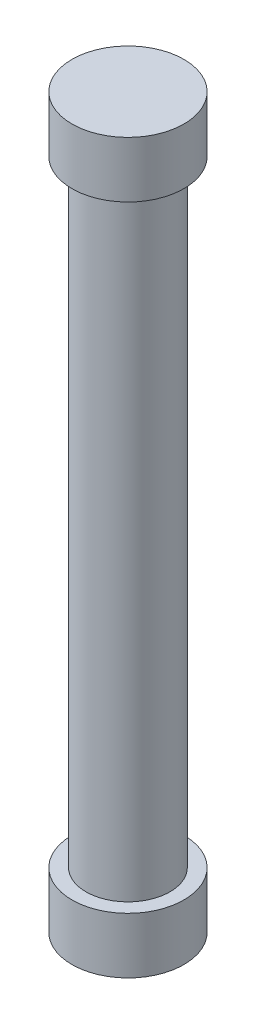
ISO-10303-21;
HEADER;
FILE_DESCRIPTION(('STEP AP214'),'2;1');
FILE_NAME('part.step','',(''),(''),'','','');
FILE_SCHEMA(('AUTOMOTIVE_DESIGN { 1 0 10303 214 1 1 1 1 }'));
ENDSEC;
DATA;
#1=APPLICATION_CONTEXT('core data for automotive mechanical design processes');
#2=APPLICATION_PROTOCOL_DEFINITION('international standard','automotive_design',2000,#1);
#3=PRODUCT_CONTEXT('',#1,'mechanical');
#4=PRODUCT('Part','Part','',(#3));
#5=PRODUCT_RELATED_PRODUCT_CATEGORY('part','',(#4));
#6=PRODUCT_DEFINITION_FORMATION('','',#4);
#7=PRODUCT_DEFINITION_CONTEXT('part definition',#1,'design');
#8=PRODUCT_DEFINITION('design','',#6,#7);
#9=PRODUCT_DEFINITION_SHAPE('','',#8);
#10=(LENGTH_UNIT() NAMED_UNIT(*) SI_UNIT(.MILLI.,.METRE.));
#11=(NAMED_UNIT(*) PLANE_ANGLE_UNIT() SI_UNIT($,.RADIAN.));
#12=(NAMED_UNIT(*) SI_UNIT($,.STERADIAN.) SOLID_ANGLE_UNIT());
#13=UNCERTAINTY_MEASURE_WITH_UNIT(LENGTH_MEASURE(1.E-05),#10,'distance_accuracy_value','');
#14=(GEOMETRIC_REPRESENTATION_CONTEXT(3) GLOBAL_UNCERTAINTY_ASSIGNED_CONTEXT((#13)) GLOBAL_UNIT_ASSIGNED_CONTEXT((#10,
#11,#12)) REPRESENTATION_CONTEXT('',''));
#15=CARTESIAN_POINT('',(0.,0.,0.));
#16=DIRECTION('',(0.,0.,1.));
#17=DIRECTION('',(1.,0.,0.));
#18=AXIS2_PLACEMENT_3D('',#15,#16,#17);
#19=CARTESIAN_POINT('',(2.,0.,0.));
#20=DIRECTION('',(0.,-1.,0.));
#21=DIRECTION('',(1.,0.,0.));
#22=AXIS2_PLACEMENT_3D('',#19,#20,#21);
#23=PLANE('',#22);
#24=CARTESIAN_POINT('',(2.,0.,0.));
#25=DIRECTION('',(0.,1.,0.));
#26=DIRECTION('',(-1.,0.,0.));
#27=AXIS2_PLACEMENT_3D('',#24,#25,#26);
#28=CIRCLE('',#27,2.);
#29=CARTESIAN_POINT('',(0.,0.,0.));
#30=VERTEX_POINT('',#29);
#31=EDGE_CURVE('E10',#30,#30,#28,.T.);
#32=ORIENTED_EDGE('',*,*,#31,.F.);
#33=EDGE_LOOP('',(#32));
#34=FACE_BOUND('',#33,.T.);
#35=ADVANCED_FACE('F40',(#34),#23,.T.);
#36=CARTESIAN_POINT('',(2.,26.,0.));
#37=DIRECTION('',(0.,1.,0.));
#38=DIRECTION('',(-1.,0.,0.));
#39=AXIS2_PLACEMENT_3D('',#36,#37,#38);
#40=CYLINDRICAL_SURFACE('',#39,2.);
#41=ORIENTED_EDGE('',*,*,#31,.T.);
#42=EDGE_LOOP('',(#41));
#43=FACE_BOUND('',#42,.T.);
#44=CARTESIAN_POINT('',(2.,2.,0.));
#45=DIRECTION('',(0.,1.,0.));
#46=DIRECTION('',(-1.,0.,0.));
#47=AXIS2_PLACEMENT_3D('',#44,#45,#46);
#48=CIRCLE('',#47,2.);
#49=CARTESIAN_POINT('',(0.,2.,0.));
#50=VERTEX_POINT('',#49);
#51=EDGE_CURVE('E46',#50,#50,#48,.T.);
#52=ORIENTED_EDGE('',*,*,#51,.F.);
#53=EDGE_LOOP('',(#52));
#54=FACE_BOUND('',#53,.T.);
#55=ADVANCED_FACE('F82',(#43,#54),#40,.T.);
#56=CARTESIAN_POINT('',(0.,2.,0.));
#57=DIRECTION('',(0.,1.,0.));
#58=DIRECTION('',(-1.,0.,0.));
#59=AXIS2_PLACEMENT_3D('',#56,#57,#58);
#60=PLANE('',#59);
#61=ORIENTED_EDGE('',*,*,#51,.T.);
#62=EDGE_LOOP('',(#61));
#63=FACE_BOUND('',#62,.T.);
#64=CARTESIAN_POINT('',(2.,2.,0.));
#65=DIRECTION('',(0.,1.,0.));
#66=DIRECTION('',(-1.,0.,0.));
#67=AXIS2_PLACEMENT_3D('',#64,#65,#66);
#68=CIRCLE('',#67,1.5);
#69=CARTESIAN_POINT('',(0.500000000000002,2.,0.));
#70=VERTEX_POINT('',#69);
#71=EDGE_CURVE('E50',#70,#70,#68,.T.);
#72=ORIENTED_EDGE('',*,*,#71,.F.);
#73=EDGE_LOOP('',(#72));
#74=FACE_BOUND('',#73,.T.);
#75=ADVANCED_FACE('F87',(#63,#74),#60,.T.);
#76=CARTESIAN_POINT('',(2.,26.,0.));
#77=DIRECTION('',(0.,1.,0.));
#78=DIRECTION('',(-1.,0.,0.));
#79=AXIS2_PLACEMENT_3D('',#76,#77,#78);
#80=CYLINDRICAL_SURFACE('',#79,1.5);
#81=ORIENTED_EDGE('',*,*,#71,.T.);
#82=EDGE_LOOP('',(#81));
#83=FACE_BOUND('',#82,.T.);
#84=CARTESIAN_POINT('',(2.,24.,0.));
#85=DIRECTION('',(0.,1.,0.));
#86=DIRECTION('',(-1.,0.,0.));
#87=AXIS2_PLACEMENT_3D('',#84,#85,#86);
#88=CIRCLE('',#87,1.49999999999999);
#89=CARTESIAN_POINT('',(0.500000000000002,24.,0.));
#90=VERTEX_POINT('',#89);
#91=EDGE_CURVE('E54',#90,#90,#88,.T.);
#92=ORIENTED_EDGE('',*,*,#91,.F.);
#93=EDGE_LOOP('',(#92));
#94=FACE_BOUND('',#93,.T.);
#95=ADVANCED_FACE('F78',(#83,#94),#80,.T.);
#96=CARTESIAN_POINT('',(0.500000000000002,24.,0.));
#97=DIRECTION('',(0.,-1.,0.));
#98=DIRECTION('',(1.,0.,0.));
#99=AXIS2_PLACEMENT_3D('',#96,#97,#98);
#100=PLANE('',#99);
#101=ORIENTED_EDGE('',*,*,#91,.T.);
#102=EDGE_LOOP('',(#101));
#103=FACE_BOUND('',#102,.T.);
#104=CARTESIAN_POINT('',(2.,24.,0.));
#105=DIRECTION('',(0.,1.,0.));
#106=DIRECTION('',(-1.,0.,0.));
#107=AXIS2_PLACEMENT_3D('',#104,#105,#106);
#108=CIRCLE('',#107,2.);
#109=CARTESIAN_POINT('',(0.,24.,0.));
#110=VERTEX_POINT('',#109);
#111=EDGE_CURVE('E59',#110,#110,#108,.T.);
#112=ORIENTED_EDGE('',*,*,#111,.F.);
#113=EDGE_LOOP('',(#112));
#114=FACE_BOUND('',#113,.T.);
#115=ADVANCED_FACE('F70',(#103,#114),#100,.T.);
#116=CARTESIAN_POINT('',(2.,26.,0.));
#117=DIRECTION('',(0.,1.,0.));
#118=DIRECTION('',(-1.,0.,0.));
#119=AXIS2_PLACEMENT_3D('',#116,#117,#118);
#120=CYLINDRICAL_SURFACE('',#119,2.);
#121=ORIENTED_EDGE('',*,*,#111,.T.);
#122=EDGE_LOOP('',(#121));
#123=FACE_BOUND('',#122,.T.);
#124=CARTESIAN_POINT('',(2.,26.,0.));
#125=DIRECTION('',(0.,1.,0.));
#126=DIRECTION('',(-1.,0.,0.));
#127=AXIS2_PLACEMENT_3D('',#124,#125,#126);
#128=CIRCLE('',#127,2.);
#129=CARTESIAN_POINT('',(0.,26.,0.));
#130=VERTEX_POINT('',#129);
#131=EDGE_CURVE('E62',#130,#130,#128,.T.);
#132=ORIENTED_EDGE('',*,*,#131,.F.);
#133=EDGE_LOOP('',(#132));
#134=FACE_BOUND('',#133,.T.);
#135=ADVANCED_FACE('F68',(#123,#134),#120,.T.);
#136=CARTESIAN_POINT('',(0.,26.,0.));
#137=DIRECTION('',(0.,1.,0.));
#138=DIRECTION('',(-1.,0.,0.));
#139=AXIS2_PLACEMENT_3D('',#136,#137,#138);
#140=PLANE('',#139);
#141=ORIENTED_EDGE('',*,*,#131,.T.);
#142=EDGE_LOOP('',(#141));
#143=FACE_BOUND('',#142,.T.);
#144=ADVANCED_FACE('F66',(#143),#140,.T.);
#145=CLOSED_SHELL('',(#35,#55,#75,#95,#115,#135,#144));
#146=MANIFOLD_SOLID_BREP('B2',#145);
#147=ADVANCED_BREP_SHAPE_REPRESENTATION('',(#18,#146),#14);
#148=SHAPE_DEFINITION_REPRESENTATION(#9,#147);
ENDSEC;
END-ISO-10303-21;
